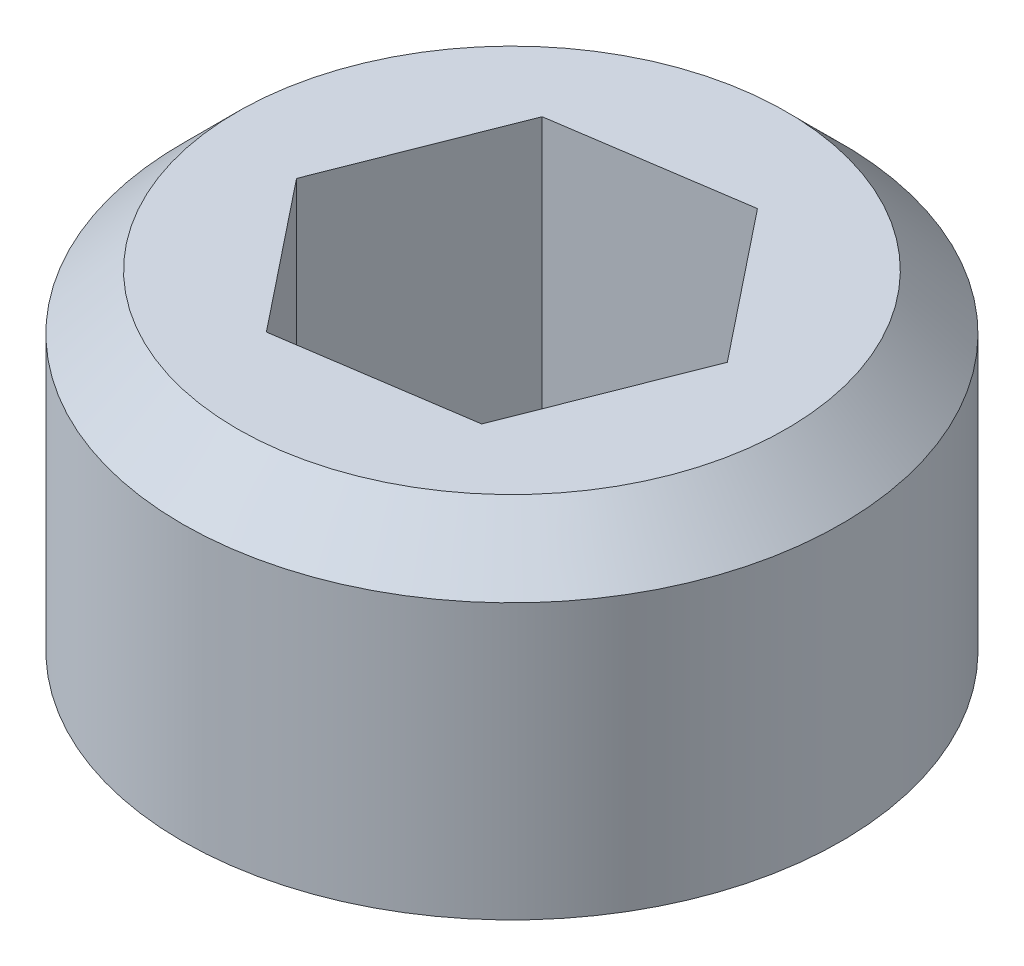
ISO-10303-21;
HEADER;
FILE_DESCRIPTION(('STEP AP214'),'2;1');
FILE_NAME('part.step','',(''),(''),'','','');
FILE_SCHEMA(('AUTOMOTIVE_DESIGN { 1 0 10303 214 1 1 1 1 }'));
ENDSEC;
DATA;
#1=APPLICATION_CONTEXT('core data for automotive mechanical design processes');
#2=APPLICATION_PROTOCOL_DEFINITION('international standard','automotive_design',2000,#1);
#3=PRODUCT_CONTEXT('',#1,'mechanical');
#4=PRODUCT('Part','Part','',(#3));
#5=PRODUCT_RELATED_PRODUCT_CATEGORY('part','',(#4));
#6=PRODUCT_DEFINITION_FORMATION('','',#4);
#7=PRODUCT_DEFINITION_CONTEXT('part definition',#1,'design');
#8=PRODUCT_DEFINITION('design','',#6,#7);
#9=PRODUCT_DEFINITION_SHAPE('','',#8);
#10=(LENGTH_UNIT() NAMED_UNIT(*) SI_UNIT(.MILLI.,.METRE.));
#11=(NAMED_UNIT(*) PLANE_ANGLE_UNIT() SI_UNIT($,.RADIAN.));
#12=(NAMED_UNIT(*) SI_UNIT($,.STERADIAN.) SOLID_ANGLE_UNIT());
#13=UNCERTAINTY_MEASURE_WITH_UNIT(LENGTH_MEASURE(1.E-05),#10,'distance_accuracy_value','');
#14=(GEOMETRIC_REPRESENTATION_CONTEXT(3) GLOBAL_UNCERTAINTY_ASSIGNED_CONTEXT((#13)) GLOBAL_UNIT_ASSIGNED_CONTEXT((#10,
#11,#12)) REPRESENTATION_CONTEXT('',''));
#15=CARTESIAN_POINT('',(0.,0.,0.));
#16=DIRECTION('',(0.,0.,1.));
#17=DIRECTION('',(1.,0.,0.));
#18=AXIS2_PLACEMENT_3D('',#15,#16,#17);
#19=CARTESIAN_POINT('',(0.,6.,0.));
#20=DIRECTION('',(0.,-1.,0.));
#21=DIRECTION('',(0.,0.,-1.));
#22=AXIS2_PLACEMENT_3D('',#19,#20,#21);
#23=CYLINDRICAL_SURFACE('',#22,6.);
#24=CARTESIAN_POINT('',(0.,4.99999999999999,0.));
#25=DIRECTION('',(0.,1.,0.));
#26=DIRECTION('',(0.,0.,1.));
#27=AXIS2_PLACEMENT_3D('',#24,#25,#26);
#28=CIRCLE('',#27,6.);
#29=CARTESIAN_POINT('',(0.,4.99999999999999,6.));
#30=VERTEX_POINT('',#29);
#31=EDGE_CURVE('E11',#30,#30,#28,.F.);
#32=ORIENTED_EDGE('',*,*,#31,.T.);
#33=EDGE_LOOP('',(#32));
#34=FACE_BOUND('',#33,.T.);
#35=CARTESIAN_POINT('',(0.,0.,0.));
#36=DIRECTION('',(0.,1.,0.));
#37=DIRECTION('',(0.,0.,1.));
#38=AXIS2_PLACEMENT_3D('',#35,#36,#37);
#39=CIRCLE('',#38,6.);
#40=CARTESIAN_POINT('',(0.,0.,6.));
#41=VERTEX_POINT('',#40);
#42=EDGE_CURVE('E134',#41,#41,#39,.T.);
#43=ORIENTED_EDGE('',*,*,#42,.T.);
#44=EDGE_LOOP('',(#43));
#45=FACE_BOUND('',#44,.T.);
#46=ADVANCED_FACE('F32',(#34,#45),#23,.T.);
#47=CARTESIAN_POINT('',(0.,6.,0.));
#48=DIRECTION('',(0.,1.,0.));
#49=DIRECTION('',(0.,0.,1.));
#50=AXIS2_PLACEMENT_3D('',#47,#48,#49);
#51=PLANE('',#50);
#52=CARTESIAN_POINT('',(0.,6.,0.));
#53=DIRECTION('',(0.,1.,0.));
#54=DIRECTION('',(0.,0.,1.));
#55=AXIS2_PLACEMENT_3D('',#52,#53,#54);
#56=CIRCLE('',#55,4.99999999999999);
#57=CARTESIAN_POINT('',(0.,6.,4.99999999999999));
#58=VERTEX_POINT('',#57);
#59=EDGE_CURVE('E40',#58,#58,#56,.T.);
#60=ORIENTED_EDGE('',*,*,#59,.T.);
#61=EDGE_LOOP('',(#60));
#62=FACE_BOUND('',#61,.T.);
#63=DIRECTION('',(-0.623021450460397,0.,-0.782204750858893));
#64=VECTOR('',#63,1.);
#65=CARTESIAN_POINT('',(3.40957319628615,6.,-0.511822272297437));
#66=LINE('',#65,#64);
#67=CARTESIAN_POINT('',(3.40957319628615,6.,-0.511822272297437));
#68=VERTEX_POINT('',#67);
#69=CARTESIAN_POINT('',(1.26153550811082,6.,-3.20868814019503));
#70=VERTEX_POINT('',#69);
#71=EDGE_CURVE('E47',#68,#70,#66,.T.);
#72=ORIENTED_EDGE('',*,*,#71,.F.);
#73=DIRECTION('',(0.36589845997448,0.,-0.930654778630779));
#74=VECTOR('',#73,1.);
#75=CARTESIAN_POINT('',(2.14803768817533,6.,2.69686586789759));
#76=LINE('',#75,#74);
#77=CARTESIAN_POINT('',(2.14803768817533,6.,2.69686586789759));
#78=VERTEX_POINT('',#77);
#79=EDGE_CURVE('E130',#78,#68,#76,.T.);
#80=ORIENTED_EDGE('',*,*,#79,.F.);
#81=DIRECTION('',(0.988919910434878,0.,-0.148450027771886));
#82=VECTOR('',#81,1.);
#83=CARTESIAN_POINT('',(-1.26153550811082,6.,3.20868814019503));
#84=LINE('',#83,#82);
#85=CARTESIAN_POINT('',(-1.26153550811082,6.,3.20868814019503));
#86=VERTEX_POINT('',#85);
#87=EDGE_CURVE('E128',#86,#78,#84,.T.);
#88=ORIENTED_EDGE('',*,*,#87,.F.);
#89=DIRECTION('',(0.623021450460398,0.,0.782204750858893));
#90=VECTOR('',#89,1.);
#91=CARTESIAN_POINT('',(-3.40957319628615,6.,0.511822272297437));
#92=LINE('',#91,#90);
#93=CARTESIAN_POINT('',(-3.40957319628615,6.,0.511822272297437));
#94=VERTEX_POINT('',#93);
#95=EDGE_CURVE('E95',#94,#86,#92,.T.);
#96=ORIENTED_EDGE('',*,*,#95,.F.);
#97=DIRECTION('',(-0.36589845997448,0.,0.930654778630779));
#98=VECTOR('',#97,1.);
#99=CARTESIAN_POINT('',(-2.14803768817533,6.,-2.69686586789759));
#100=LINE('',#99,#98);
#101=CARTESIAN_POINT('',(-2.14803768817533,6.,-2.69686586789759));
#102=VERTEX_POINT('',#101);
#103=EDGE_CURVE('E124',#102,#94,#100,.T.);
#104=ORIENTED_EDGE('',*,*,#103,.F.);
#105=DIRECTION('',(-0.988919910434878,0.,0.148450027771886));
#106=VECTOR('',#105,1.);
#107=CARTESIAN_POINT('',(1.26153550811082,6.,-3.20868814019503));
#108=LINE('',#107,#106);
#109=EDGE_CURVE('E121',#70,#102,#108,.T.);
#110=ORIENTED_EDGE('',*,*,#109,.F.);
#111=EDGE_LOOP('',(#72,#80,#88,#96,#104,#110));
#112=FACE_BOUND('',#111,.T.);
#113=ADVANCED_FACE('F144',(#62,#112),#51,.T.);
#114=CARTESIAN_POINT('',(0.,0.,0.));
#115=DIRECTION('',(0.,1.,0.));
#116=DIRECTION('',(0.,0.,1.));
#117=AXIS2_PLACEMENT_3D('',#114,#115,#116);
#118=PLANE('',#117);
#119=ORIENTED_EDGE('',*,*,#42,.F.);
#120=EDGE_LOOP('',(#119));
#121=FACE_BOUND('',#120,.T.);
#122=ADVANCED_FACE('F160',(#121),#118,.F.);
#123=CARTESIAN_POINT('',(3.40957319628615,1.,-0.511822272297437));
#124=DIRECTION('',(0.782204750858893,0.,-0.623021450460397));
#125=DIRECTION('',(-0.623021450460397,0.,-0.782204750858893));
#126=AXIS2_PLACEMENT_3D('',#123,#124,#125);
#127=PLANE('',#126);
#128=ORIENTED_EDGE('',*,*,#71,.T.);
#129=DIRECTION('',(0.,1.,0.));
#130=VECTOR('',#129,1.);
#131=CARTESIAN_POINT('',(1.26153550811082,1.,-3.20868814019503));
#132=LINE('',#131,#130);
#133=CARTESIAN_POINT('',(1.26153550811082,1.,-3.20868814019503));
#134=VERTEX_POINT('',#133);
#135=EDGE_CURVE('E77',#134,#70,#132,.T.);
#136=ORIENTED_EDGE('',*,*,#135,.F.);
#137=DIRECTION('',(-0.623021450460397,0.,-0.782204750858893));
#138=VECTOR('',#137,1.);
#139=CARTESIAN_POINT('',(3.40957319628615,1.,-0.511822272297437));
#140=LINE('',#139,#138);
#141=CARTESIAN_POINT('',(3.40957319628615,1.,-0.511822272297437));
#142=VERTEX_POINT('',#141);
#143=EDGE_CURVE('E132',#142,#134,#140,.T.);
#144=ORIENTED_EDGE('',*,*,#143,.F.);
#145=DIRECTION('',(0.,1.,0.));
#146=VECTOR('',#145,1.);
#147=CARTESIAN_POINT('',(3.40957319628615,1.,-0.511822272297437));
#148=LINE('',#147,#146);
#149=EDGE_CURVE('E55',#142,#68,#148,.T.);
#150=ORIENTED_EDGE('',*,*,#149,.T.);
#151=EDGE_LOOP('',(#128,#136,#144,#150));
#152=FACE_BOUND('',#151,.T.);
#153=ADVANCED_FACE('F165',(#152),#127,.F.);
#154=CARTESIAN_POINT('',(2.14803768817533,1.,2.69686586789759));
#155=DIRECTION('',(0.930654778630779,0.,0.36589845997448));
#156=DIRECTION('',(0.36589845997448,0.,-0.930654778630779));
#157=AXIS2_PLACEMENT_3D('',#154,#155,#156);
#158=PLANE('',#157);
#159=ORIENTED_EDGE('',*,*,#79,.T.);
#160=ORIENTED_EDGE('',*,*,#149,.F.);
#161=DIRECTION('',(0.36589845997448,0.,-0.930654778630779));
#162=VECTOR('',#161,1.);
#163=CARTESIAN_POINT('',(2.14803768817533,1.,2.69686586789759));
#164=LINE('',#163,#162);
#165=CARTESIAN_POINT('',(2.14803768817533,1.,2.69686586789759));
#166=VERTEX_POINT('',#165);
#167=EDGE_CURVE('E107',#166,#142,#164,.T.);
#168=ORIENTED_EDGE('',*,*,#167,.F.);
#169=DIRECTION('',(0.,1.,0.));
#170=VECTOR('',#169,1.);
#171=CARTESIAN_POINT('',(2.14803768817533,1.,2.69686586789759));
#172=LINE('',#171,#170);
#173=EDGE_CURVE('E99',#166,#78,#172,.T.);
#174=ORIENTED_EDGE('',*,*,#173,.T.);
#175=EDGE_LOOP('',(#159,#160,#168,#174));
#176=FACE_BOUND('',#175,.T.);
#177=ADVANCED_FACE('F170',(#176),#158,.F.);
#178=CARTESIAN_POINT('',(-1.26153550811082,1.,3.20868814019503));
#179=DIRECTION('',(0.148450027771886,0.,0.988919910434878));
#180=DIRECTION('',(0.988919910434878,0.,-0.148450027771886));
#181=AXIS2_PLACEMENT_3D('',#178,#179,#180);
#182=PLANE('',#181);
#183=ORIENTED_EDGE('',*,*,#87,.T.);
#184=ORIENTED_EDGE('',*,*,#173,.F.);
#185=DIRECTION('',(0.988919910434878,0.,-0.148450027771886));
#186=VECTOR('',#185,1.);
#187=CARTESIAN_POINT('',(-1.26153550811082,1.,3.20868814019503));
#188=LINE('',#187,#186);
#189=CARTESIAN_POINT('',(-1.26153550811082,1.,3.20868814019503));
#190=VERTEX_POINT('',#189);
#191=EDGE_CURVE('E103',#190,#166,#188,.T.);
#192=ORIENTED_EDGE('',*,*,#191,.F.);
#193=DIRECTION('',(0.,1.,0.));
#194=VECTOR('',#193,1.);
#195=CARTESIAN_POINT('',(-1.26153550811082,1.,3.20868814019503));
#196=LINE('',#195,#194);
#197=EDGE_CURVE('E88',#190,#86,#196,.T.);
#198=ORIENTED_EDGE('',*,*,#197,.T.);
#199=EDGE_LOOP('',(#183,#184,#192,#198));
#200=FACE_BOUND('',#199,.T.);
#201=ADVANCED_FACE('F104',(#200),#182,.F.);
#202=CARTESIAN_POINT('',(-3.40957319628615,1.,0.511822272297437));
#203=DIRECTION('',(-0.782204750858893,0.,0.623021450460398));
#204=DIRECTION('',(0.623021450460398,0.,0.782204750858893));
#205=AXIS2_PLACEMENT_3D('',#202,#203,#204);
#206=PLANE('',#205);
#207=ORIENTED_EDGE('',*,*,#95,.T.);
#208=ORIENTED_EDGE('',*,*,#197,.F.);
#209=DIRECTION('',(0.623021450460398,0.,0.782204750858893));
#210=VECTOR('',#209,1.);
#211=CARTESIAN_POINT('',(-3.40957319628615,1.,0.511822272297437));
#212=LINE('',#211,#210);
#213=CARTESIAN_POINT('',(-3.40957319628615,1.,0.511822272297437));
#214=VERTEX_POINT('',#213);
#215=EDGE_CURVE('E92',#214,#190,#212,.T.);
#216=ORIENTED_EDGE('',*,*,#215,.F.);
#217=DIRECTION('',(0.,1.,0.));
#218=VECTOR('',#217,1.);
#219=CARTESIAN_POINT('',(-3.40957319628615,1.,0.511822272297437));
#220=LINE('',#219,#218);
#221=EDGE_CURVE('E100',#214,#94,#220,.T.);
#222=ORIENTED_EDGE('',*,*,#221,.T.);
#223=EDGE_LOOP('',(#207,#208,#216,#222));
#224=FACE_BOUND('',#223,.T.);
#225=ADVANCED_FACE('F90',(#224),#206,.F.);
#226=CARTESIAN_POINT('',(-2.14803768817533,1.,-2.69686586789759));
#227=DIRECTION('',(-0.930654778630779,0.,-0.36589845997448));
#228=DIRECTION('',(-0.36589845997448,0.,0.930654778630779));
#229=AXIS2_PLACEMENT_3D('',#226,#227,#228);
#230=PLANE('',#229);
#231=ORIENTED_EDGE('',*,*,#103,.T.);
#232=ORIENTED_EDGE('',*,*,#221,.F.);
#233=DIRECTION('',(-0.36589845997448,0.,0.930654778630779));
#234=VECTOR('',#233,1.);
#235=CARTESIAN_POINT('',(-2.14803768817533,1.,-2.69686586789759));
#236=LINE('',#235,#234);
#237=CARTESIAN_POINT('',(-2.14803768817533,1.,-2.69686586789759));
#238=VERTEX_POINT('',#237);
#239=EDGE_CURVE('E113',#238,#214,#236,.T.);
#240=ORIENTED_EDGE('',*,*,#239,.F.);
#241=DIRECTION('',(0.,1.,0.));
#242=VECTOR('',#241,1.);
#243=CARTESIAN_POINT('',(-2.14803768817533,1.,-2.69686586789759));
#244=LINE('',#243,#242);
#245=EDGE_CURVE('E137',#238,#102,#244,.T.);
#246=ORIENTED_EDGE('',*,*,#245,.T.);
#247=EDGE_LOOP('',(#231,#232,#240,#246));
#248=FACE_BOUND('',#247,.T.);
#249=ADVANCED_FACE('F173',(#248),#230,.F.);
#250=CARTESIAN_POINT('',(1.26153550811082,1.,-3.20868814019503));
#251=DIRECTION('',(-0.148450027771886,0.,-0.988919910434878));
#252=DIRECTION('',(-0.988919910434878,0.,0.148450027771886));
#253=AXIS2_PLACEMENT_3D('',#250,#251,#252);
#254=PLANE('',#253);
#255=ORIENTED_EDGE('',*,*,#109,.T.);
#256=ORIENTED_EDGE('',*,*,#245,.F.);
#257=DIRECTION('',(-0.988919910434878,0.,0.148450027771886));
#258=VECTOR('',#257,1.);
#259=CARTESIAN_POINT('',(1.26153550811082,1.,-3.20868814019503));
#260=LINE('',#259,#258);
#261=EDGE_CURVE('E115',#134,#238,#260,.T.);
#262=ORIENTED_EDGE('',*,*,#261,.F.);
#263=ORIENTED_EDGE('',*,*,#135,.T.);
#264=EDGE_LOOP('',(#255,#256,#262,#263));
#265=FACE_BOUND('',#264,.T.);
#266=ADVANCED_FACE('F152',(#265),#254,.F.);
#267=CARTESIAN_POINT('',(1.26153550811082,1.,-3.20868814019503));
#268=DIRECTION('',(0.,1.,0.));
#269=DIRECTION('',(0.,0.,1.));
#270=AXIS2_PLACEMENT_3D('',#267,#268,#269);
#271=PLANE('',#270);
#272=ORIENTED_EDGE('',*,*,#143,.T.);
#273=ORIENTED_EDGE('',*,*,#261,.T.);
#274=ORIENTED_EDGE('',*,*,#239,.T.);
#275=ORIENTED_EDGE('',*,*,#215,.T.);
#276=ORIENTED_EDGE('',*,*,#191,.T.);
#277=ORIENTED_EDGE('',*,*,#167,.T.);
#278=EDGE_LOOP('',(#272,#273,#274,#275,#276,#277));
#279=FACE_BOUND('',#278,.T.);
#280=ADVANCED_FACE('F110',(#279),#271,.T.);
#281=CARTESIAN_POINT('',(0.,6.,0.));
#282=DIRECTION('',(0.,-1.,0.));
#283=DIRECTION('',(0.,0.,-1.));
#284=AXIS2_PLACEMENT_3D('',#281,#282,#283);
#285=CONICAL_SURFACE('',#284,4.99999999999999,0.785398163397447);
#286=ORIENTED_EDGE('',*,*,#31,.F.);
#287=EDGE_LOOP('',(#286));
#288=FACE_BOUND('',#287,.T.);
#289=ORIENTED_EDGE('',*,*,#59,.F.);
#290=EDGE_LOOP('',(#289));
#291=FACE_BOUND('',#290,.T.);
#292=ADVANCED_FACE('F34',(#288,#291),#285,.T.);
#293=CLOSED_SHELL('',(#46,#113,#122,#153,#177,#201,#225,#249,#266,#280,#292));
#294=MANIFOLD_SOLID_BREP('B2',#293);
#295=ADVANCED_BREP_SHAPE_REPRESENTATION('',(#18,#294),#14);
#296=SHAPE_DEFINITION_REPRESENTATION(#9,#295);
ENDSEC;
END-ISO-10303-21;
